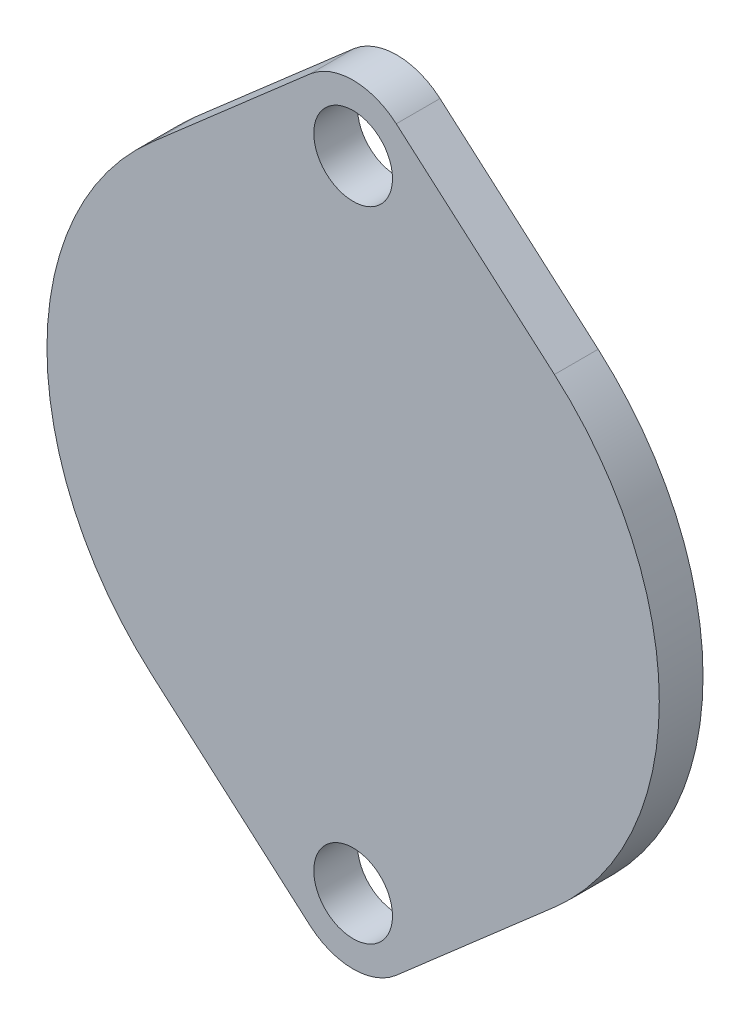
ISO-10303-21;
HEADER;
FILE_DESCRIPTION(('STEP AP214'),'2;1');
FILE_NAME('part.step','',(''),(''),'','','');
FILE_SCHEMA(('AUTOMOTIVE_DESIGN { 1 0 10303 214 1 1 1 1 }'));
ENDSEC;
DATA;
#1=APPLICATION_CONTEXT('core data for automotive mechanical design processes');
#2=APPLICATION_PROTOCOL_DEFINITION('international standard','automotive_design',2000,#1);
#3=PRODUCT_CONTEXT('',#1,'mechanical');
#4=PRODUCT('Part','Part','',(#3));
#5=PRODUCT_RELATED_PRODUCT_CATEGORY('part','',(#4));
#6=PRODUCT_DEFINITION_FORMATION('','',#4);
#7=PRODUCT_DEFINITION_CONTEXT('part definition',#1,'design');
#8=PRODUCT_DEFINITION('design','',#6,#7);
#9=PRODUCT_DEFINITION_SHAPE('','',#8);
#10=(LENGTH_UNIT() NAMED_UNIT(*) SI_UNIT(.MILLI.,.METRE.));
#11=(NAMED_UNIT(*) PLANE_ANGLE_UNIT() SI_UNIT($,.RADIAN.));
#12=(NAMED_UNIT(*) SI_UNIT($,.STERADIAN.) SOLID_ANGLE_UNIT());
#13=UNCERTAINTY_MEASURE_WITH_UNIT(LENGTH_MEASURE(1.E-05),#10,'distance_accuracy_value','');
#14=(GEOMETRIC_REPRESENTATION_CONTEXT(3) GLOBAL_UNCERTAINTY_ASSIGNED_CONTEXT((#13)) GLOBAL_UNIT_ASSIGNED_CONTEXT((#10,
#11,#12)) REPRESENTATION_CONTEXT('',''));
#15=CARTESIAN_POINT('',(0.,0.,0.));
#16=DIRECTION('',(0.,0.,1.));
#17=DIRECTION('',(1.,0.,0.));
#18=AXIS2_PLACEMENT_3D('',#15,#16,#17);
#19=CARTESIAN_POINT('',(0.,-36.5,5.));
#20=DIRECTION('',(0.,0.,1.));
#21=DIRECTION('',(1.,0.,0.));
#22=AXIS2_PLACEMENT_3D('',#19,#20,#21);
#23=PLANE('',#22);
#24=CARTESIAN_POINT('',(0.,36.5,5.));
#25=DIRECTION('',(0.,0.,1.));
#26=DIRECTION('',(1.,0.,0.));
#27=AXIS2_PLACEMENT_3D('',#24,#25,#26);
#28=CIRCLE('',#27,4.5);
#29=CARTESIAN_POINT('',(4.5,36.5,5.));
#30=VERTEX_POINT('',#29);
#31=EDGE_CURVE('E132',#30,#30,#28,.T.);
#32=ORIENTED_EDGE('',*,*,#31,.F.);
#33=EDGE_LOOP('',(#32));
#34=FACE_BOUND('',#33,.T.);
#35=CARTESIAN_POINT('',(0.,-36.5,5.));
#36=DIRECTION('',(0.,0.,1.));
#37=DIRECTION('',(1.,0.,0.));
#38=AXIS2_PLACEMENT_3D('',#35,#36,#37);
#39=CIRCLE('',#38,7.5);
#40=CARTESIAN_POINT('',(-4.93150684931507,-42.1506849315069,5.));
#41=VERTEX_POINT('',#40);
#42=CARTESIAN_POINT('',(4.93150684931507,-42.1506849315069,5.));
#43=VERTEX_POINT('',#42);
#44=EDGE_CURVE('E143',#41,#43,#39,.T.);
#45=ORIENTED_EDGE('',*,*,#44,.T.);
#46=DIRECTION('',(0.753424657534247,0.657534246575342,0.));
#47=VECTOR('',#46,1.);
#48=CARTESIAN_POINT('',(4.93150684931507,-42.1506849315069,5.));
#49=LINE('',#48,#47);
#50=CARTESIAN_POINT('',(23.013698630137,-26.3698630136986,5.));
#51=VERTEX_POINT('',#50);
#52=EDGE_CURVE('E91',#43,#51,#49,.T.);
#53=ORIENTED_EDGE('',*,*,#52,.T.);
#54=CARTESIAN_POINT('',(0.,0.,5.));
#55=DIRECTION('',(0.,0.,1.));
#56=DIRECTION('',(1.,0.,0.));
#57=AXIS2_PLACEMENT_3D('',#54,#55,#56);
#58=CIRCLE('',#57,35.);
#59=CARTESIAN_POINT('',(23.013698630137,26.3698630136986,5.));
#60=VERTEX_POINT('',#59);
#61=EDGE_CURVE('E158',#51,#60,#58,.T.);
#62=ORIENTED_EDGE('',*,*,#61,.T.);
#63=DIRECTION('',(-0.753424657534247,0.657534246575342,0.));
#64=VECTOR('',#63,1.);
#65=CARTESIAN_POINT('',(23.013698630137,26.3698630136986,5.));
#66=LINE('',#65,#64);
#67=CARTESIAN_POINT('',(4.93150684931507,42.1506849315069,5.));
#68=VERTEX_POINT('',#67);
#69=EDGE_CURVE('E171',#60,#68,#66,.T.);
#70=ORIENTED_EDGE('',*,*,#69,.T.);
#71=CARTESIAN_POINT('',(0.,36.5,5.));
#72=DIRECTION('',(0.,0.,1.));
#73=DIRECTION('',(1.,0.,0.));
#74=AXIS2_PLACEMENT_3D('',#71,#72,#73);
#75=CIRCLE('',#74,7.5);
#76=CARTESIAN_POINT('',(-4.93150684931507,42.1506849315069,5.));
#77=VERTEX_POINT('',#76);
#78=EDGE_CURVE('E110',#68,#77,#75,.T.);
#79=ORIENTED_EDGE('',*,*,#78,.T.);
#80=DIRECTION('',(-0.753424657534247,-0.657534246575342,0.));
#81=VECTOR('',#80,1.);
#82=CARTESIAN_POINT('',(-23.013698630137,26.3698630136986,5.));
#83=LINE('',#82,#81);
#84=CARTESIAN_POINT('',(-23.013698630137,26.3698630136986,5.));
#85=VERTEX_POINT('',#84);
#86=EDGE_CURVE('E104',#77,#85,#83,.T.);
#87=ORIENTED_EDGE('',*,*,#86,.T.);
#88=CARTESIAN_POINT('',(0.,0.,5.));
#89=DIRECTION('',(0.,0.,1.));
#90=DIRECTION('',(1.,0.,0.));
#91=AXIS2_PLACEMENT_3D('',#88,#89,#90);
#92=CIRCLE('',#91,35.);
#93=CARTESIAN_POINT('',(-23.013698630137,-26.3698630136987,5.));
#94=VERTEX_POINT('',#93);
#95=EDGE_CURVE('E108',#85,#94,#92,.T.);
#96=ORIENTED_EDGE('',*,*,#95,.T.);
#97=DIRECTION('',(0.753424657534247,-0.657534246575342,0.));
#98=VECTOR('',#97,1.);
#99=CARTESIAN_POINT('',(-4.93150684931507,-42.1506849315069,5.));
#100=LINE('',#99,#98);
#101=EDGE_CURVE('E48',#94,#41,#100,.T.);
#102=ORIENTED_EDGE('',*,*,#101,.T.);
#103=EDGE_LOOP('',(#45,#53,#62,#70,#79,#87,#96,#102));
#104=FACE_BOUND('',#103,.T.);
#105=CARTESIAN_POINT('',(0.,-36.5,5.));
#106=DIRECTION('',(0.,0.,1.));
#107=DIRECTION('',(1.,0.,0.));
#108=AXIS2_PLACEMENT_3D('',#105,#106,#107);
#109=CIRCLE('',#108,4.5);
#110=CARTESIAN_POINT('',(4.5,-36.5,5.));
#111=VERTEX_POINT('',#110);
#112=EDGE_CURVE('E180',#111,#111,#109,.T.);
#113=ORIENTED_EDGE('',*,*,#112,.F.);
#114=EDGE_LOOP('',(#113));
#115=FACE_BOUND('',#114,.T.);
#116=ADVANCED_FACE('F31',(#34,#104,#115),#23,.T.);
#117=CARTESIAN_POINT('',(0.,-36.5,0.));
#118=DIRECTION('',(0.,0.,1.));
#119=DIRECTION('',(1.,0.,0.));
#120=AXIS2_PLACEMENT_3D('',#117,#118,#119);
#121=PLANE('',#120);
#122=CARTESIAN_POINT('',(0.,36.5,0.));
#123=DIRECTION('',(0.,0.,1.));
#124=DIRECTION('',(1.,0.,0.));
#125=AXIS2_PLACEMENT_3D('',#122,#123,#124);
#126=CIRCLE('',#125,4.5);
#127=CARTESIAN_POINT('',(4.5,36.5,0.));
#128=VERTEX_POINT('',#127);
#129=EDGE_CURVE('E177',#128,#128,#126,.T.);
#130=ORIENTED_EDGE('',*,*,#129,.T.);
#131=EDGE_LOOP('',(#130));
#132=FACE_BOUND('',#131,.T.);
#133=CARTESIAN_POINT('',(0.,-36.5,0.));
#134=DIRECTION('',(0.,0.,1.));
#135=DIRECTION('',(1.,0.,0.));
#136=AXIS2_PLACEMENT_3D('',#133,#134,#135);
#137=CIRCLE('',#136,7.5);
#138=CARTESIAN_POINT('',(-4.93150684931507,-42.1506849315069,0.));
#139=VERTEX_POINT('',#138);
#140=CARTESIAN_POINT('',(4.93150684931507,-42.1506849315069,0.));
#141=VERTEX_POINT('',#140);
#142=EDGE_CURVE('E128',#139,#141,#137,.T.);
#143=ORIENTED_EDGE('',*,*,#142,.F.);
#144=DIRECTION('',(0.753424657534247,-0.657534246575342,0.));
#145=VECTOR('',#144,1.);
#146=CARTESIAN_POINT('',(-4.93150684931507,-42.1506849315069,0.));
#147=LINE('',#146,#145);
#148=CARTESIAN_POINT('',(-23.013698630137,-26.3698630136987,0.));
#149=VERTEX_POINT('',#148);
#150=EDGE_CURVE('E83',#149,#139,#147,.T.);
#151=ORIENTED_EDGE('',*,*,#150,.F.);
#152=CARTESIAN_POINT('',(0.,0.,0.));
#153=DIRECTION('',(0.,0.,1.));
#154=DIRECTION('',(1.,0.,0.));
#155=AXIS2_PLACEMENT_3D('',#152,#153,#154);
#156=CIRCLE('',#155,35.);
#157=CARTESIAN_POINT('',(-23.013698630137,26.3698630136986,0.));
#158=VERTEX_POINT('',#157);
#159=EDGE_CURVE('E77',#158,#149,#156,.T.);
#160=ORIENTED_EDGE('',*,*,#159,.F.);
#161=DIRECTION('',(-0.753424657534247,-0.657534246575342,0.));
#162=VECTOR('',#161,1.);
#163=CARTESIAN_POINT('',(-23.013698630137,26.3698630136986,0.));
#164=LINE('',#163,#162);
#165=CARTESIAN_POINT('',(-4.93150684931507,42.1506849315069,0.));
#166=VERTEX_POINT('',#165);
#167=EDGE_CURVE('E118',#166,#158,#164,.T.);
#168=ORIENTED_EDGE('',*,*,#167,.F.);
#169=CARTESIAN_POINT('',(0.,36.5,0.));
#170=DIRECTION('',(0.,0.,1.));
#171=DIRECTION('',(1.,0.,0.));
#172=AXIS2_PLACEMENT_3D('',#169,#170,#171);
#173=CIRCLE('',#172,7.5);
#174=CARTESIAN_POINT('',(4.93150684931507,42.1506849315069,0.));
#175=VERTEX_POINT('',#174);
#176=EDGE_CURVE('E138',#175,#166,#173,.T.);
#177=ORIENTED_EDGE('',*,*,#176,.F.);
#178=DIRECTION('',(-0.753424657534247,0.657534246575342,0.));
#179=VECTOR('',#178,1.);
#180=CARTESIAN_POINT('',(23.013698630137,26.3698630136986,0.));
#181=LINE('',#180,#179);
#182=CARTESIAN_POINT('',(23.013698630137,26.3698630136986,0.));
#183=VERTEX_POINT('',#182);
#184=EDGE_CURVE('E136',#183,#175,#181,.T.);
#185=ORIENTED_EDGE('',*,*,#184,.F.);
#186=CARTESIAN_POINT('',(0.,0.,0.));
#187=DIRECTION('',(0.,0.,1.));
#188=DIRECTION('',(1.,0.,0.));
#189=AXIS2_PLACEMENT_3D('',#186,#187,#188);
#190=CIRCLE('',#189,35.);
#191=CARTESIAN_POINT('',(23.013698630137,-26.3698630136986,0.));
#192=VERTEX_POINT('',#191);
#193=EDGE_CURVE('E134',#192,#183,#190,.T.);
#194=ORIENTED_EDGE('',*,*,#193,.F.);
#195=DIRECTION('',(0.753424657534247,0.657534246575342,0.));
#196=VECTOR('',#195,1.);
#197=CARTESIAN_POINT('',(4.93150684931507,-42.1506849315069,0.));
#198=LINE('',#197,#196);
#199=EDGE_CURVE('E131',#141,#192,#198,.T.);
#200=ORIENTED_EDGE('',*,*,#199,.F.);
#201=EDGE_LOOP('',(#143,#151,#160,#168,#177,#185,#194,#200));
#202=FACE_BOUND('',#201,.T.);
#203=CARTESIAN_POINT('',(0.,-36.5,0.));
#204=DIRECTION('',(0.,0.,1.));
#205=DIRECTION('',(1.,0.,0.));
#206=AXIS2_PLACEMENT_3D('',#203,#204,#205);
#207=CIRCLE('',#206,4.5);
#208=CARTESIAN_POINT('',(4.5,-36.5,0.));
#209=VERTEX_POINT('',#208);
#210=EDGE_CURVE('E183',#209,#209,#207,.T.);
#211=ORIENTED_EDGE('',*,*,#210,.T.);
#212=EDGE_LOOP('',(#211));
#213=FACE_BOUND('',#212,.T.);
#214=ADVANCED_FACE('F162',(#132,#202,#213),#121,.F.);
#215=CARTESIAN_POINT('',(0.,-36.5,5.));
#216=DIRECTION('',(0.,0.,-1.));
#217=DIRECTION('',(-1.,0.,0.));
#218=AXIS2_PLACEMENT_3D('',#215,#216,#217);
#219=CYLINDRICAL_SURFACE('',#218,7.5);
#220=ORIENTED_EDGE('',*,*,#142,.T.);
#221=DIRECTION('',(0.,0.,-1.));
#222=VECTOR('',#221,1.);
#223=CARTESIAN_POINT('',(4.93150684931507,-42.1506849315069,5.));
#224=LINE('',#223,#222);
#225=EDGE_CURVE('E11',#43,#141,#224,.T.);
#226=ORIENTED_EDGE('',*,*,#225,.F.);
#227=ORIENTED_EDGE('',*,*,#44,.F.);
#228=DIRECTION('',(0.,0.,-1.));
#229=VECTOR('',#228,1.);
#230=CARTESIAN_POINT('',(-4.93150684931507,-42.1506849315069,5.));
#231=LINE('',#230,#229);
#232=EDGE_CURVE('E124',#41,#139,#231,.T.);
#233=ORIENTED_EDGE('',*,*,#232,.T.);
#234=EDGE_LOOP('',(#220,#226,#227,#233));
#235=FACE_BOUND('',#234,.T.);
#236=ADVANCED_FACE('F33',(#235),#219,.T.);
#237=CARTESIAN_POINT('',(4.93150684931507,-42.1506849315069,5.));
#238=DIRECTION('',(-0.657534246575342,0.753424657534247,0.));
#239=DIRECTION('',(-0.753424657534247,-0.657534246575342,0.));
#240=AXIS2_PLACEMENT_3D('',#237,#238,#239);
#241=PLANE('',#240);
#242=ORIENTED_EDGE('',*,*,#199,.T.);
#243=DIRECTION('',(0.,0.,-1.));
#244=VECTOR('',#243,1.);
#245=CARTESIAN_POINT('',(23.013698630137,-26.3698630136986,5.));
#246=LINE('',#245,#244);
#247=EDGE_CURVE('E40',#51,#192,#246,.T.);
#248=ORIENTED_EDGE('',*,*,#247,.F.);
#249=ORIENTED_EDGE('',*,*,#52,.F.);
#250=ORIENTED_EDGE('',*,*,#225,.T.);
#251=EDGE_LOOP('',(#242,#248,#249,#250));
#252=FACE_BOUND('',#251,.T.);
#253=ADVANCED_FACE('F216',(#252),#241,.F.);
#254=CARTESIAN_POINT('',(0.,0.,5.));
#255=DIRECTION('',(0.,0.,-1.));
#256=DIRECTION('',(-1.,0.,0.));
#257=AXIS2_PLACEMENT_3D('',#254,#255,#256);
#258=CYLINDRICAL_SURFACE('',#257,35.);
#259=ORIENTED_EDGE('',*,*,#193,.T.);
#260=DIRECTION('',(0.,0.,-1.));
#261=VECTOR('',#260,1.);
#262=CARTESIAN_POINT('',(23.013698630137,26.3698630136986,5.));
#263=LINE('',#262,#261);
#264=EDGE_CURVE('E150',#60,#183,#263,.T.);
#265=ORIENTED_EDGE('',*,*,#264,.F.);
#266=ORIENTED_EDGE('',*,*,#61,.F.);
#267=ORIENTED_EDGE('',*,*,#247,.T.);
#268=EDGE_LOOP('',(#259,#265,#266,#267));
#269=FACE_BOUND('',#268,.T.);
#270=ADVANCED_FACE('F156',(#269),#258,.T.);
#271=CARTESIAN_POINT('',(23.013698630137,26.3698630136986,5.));
#272=DIRECTION('',(-0.657534246575342,-0.753424657534247,0.));
#273=DIRECTION('',(0.753424657534247,-0.657534246575342,0.));
#274=AXIS2_PLACEMENT_3D('',#271,#272,#273);
#275=PLANE('',#274);
#276=ORIENTED_EDGE('',*,*,#184,.T.);
#277=DIRECTION('',(0.,0.,-1.));
#278=VECTOR('',#277,1.);
#279=CARTESIAN_POINT('',(4.93150684931507,42.1506849315069,5.));
#280=LINE('',#279,#278);
#281=EDGE_CURVE('E147',#68,#175,#280,.T.);
#282=ORIENTED_EDGE('',*,*,#281,.F.);
#283=ORIENTED_EDGE('',*,*,#69,.F.);
#284=ORIENTED_EDGE('',*,*,#264,.T.);
#285=EDGE_LOOP('',(#276,#282,#283,#284));
#286=FACE_BOUND('',#285,.T.);
#287=ADVANCED_FACE('F167',(#286),#275,.F.);
#288=CARTESIAN_POINT('',(0.,36.5,5.));
#289=DIRECTION('',(0.,0.,-1.));
#290=DIRECTION('',(-1.,0.,0.));
#291=AXIS2_PLACEMENT_3D('',#288,#289,#290);
#292=CYLINDRICAL_SURFACE('',#291,7.5);
#293=ORIENTED_EDGE('',*,*,#176,.T.);
#294=DIRECTION('',(0.,0.,-1.));
#295=VECTOR('',#294,1.);
#296=CARTESIAN_POINT('',(-4.93150684931507,42.1506849315069,5.));
#297=LINE('',#296,#295);
#298=EDGE_CURVE('E119',#77,#166,#297,.T.);
#299=ORIENTED_EDGE('',*,*,#298,.F.);
#300=ORIENTED_EDGE('',*,*,#78,.F.);
#301=ORIENTED_EDGE('',*,*,#281,.T.);
#302=EDGE_LOOP('',(#293,#299,#300,#301));
#303=FACE_BOUND('',#302,.T.);
#304=ADVANCED_FACE('F170',(#303),#292,.T.);
#305=CARTESIAN_POINT('',(-23.013698630137,26.3698630136986,5.));
#306=DIRECTION('',(0.657534246575342,-0.753424657534247,0.));
#307=DIRECTION('',(0.753424657534247,0.657534246575342,0.));
#308=AXIS2_PLACEMENT_3D('',#305,#306,#307);
#309=PLANE('',#308);
#310=ORIENTED_EDGE('',*,*,#167,.T.);
#311=DIRECTION('',(0.,0.,-1.));
#312=VECTOR('',#311,1.);
#313=CARTESIAN_POINT('',(-23.013698630137,26.3698630136986,5.));
#314=LINE('',#313,#312);
#315=EDGE_CURVE('E115',#85,#158,#314,.T.);
#316=ORIENTED_EDGE('',*,*,#315,.F.);
#317=ORIENTED_EDGE('',*,*,#86,.F.);
#318=ORIENTED_EDGE('',*,*,#298,.T.);
#319=EDGE_LOOP('',(#310,#316,#317,#318));
#320=FACE_BOUND('',#319,.T.);
#321=ADVANCED_FACE('F116',(#320),#309,.F.);
#322=CARTESIAN_POINT('',(0.,0.,5.));
#323=DIRECTION('',(0.,0.,-1.));
#324=DIRECTION('',(-1.,0.,0.));
#325=AXIS2_PLACEMENT_3D('',#322,#323,#324);
#326=CYLINDRICAL_SURFACE('',#325,35.);
#327=ORIENTED_EDGE('',*,*,#159,.T.);
#328=DIRECTION('',(0.,0.,-1.));
#329=VECTOR('',#328,1.);
#330=CARTESIAN_POINT('',(-23.013698630137,-26.3698630136987,5.));
#331=LINE('',#330,#329);
#332=EDGE_CURVE('E120',#94,#149,#331,.T.);
#333=ORIENTED_EDGE('',*,*,#332,.F.);
#334=ORIENTED_EDGE('',*,*,#95,.F.);
#335=ORIENTED_EDGE('',*,*,#315,.T.);
#336=EDGE_LOOP('',(#327,#333,#334,#335));
#337=FACE_BOUND('',#336,.T.);
#338=ADVANCED_FACE('F122',(#337),#326,.T.);
#339=CARTESIAN_POINT('',(-4.93150684931507,-42.1506849315069,5.));
#340=DIRECTION('',(0.657534246575342,0.753424657534247,0.));
#341=DIRECTION('',(-0.753424657534247,0.657534246575342,0.));
#342=AXIS2_PLACEMENT_3D('',#339,#340,#341);
#343=PLANE('',#342);
#344=ORIENTED_EDGE('',*,*,#150,.T.);
#345=ORIENTED_EDGE('',*,*,#232,.F.);
#346=ORIENTED_EDGE('',*,*,#101,.F.);
#347=ORIENTED_EDGE('',*,*,#332,.T.);
#348=EDGE_LOOP('',(#344,#345,#346,#347));
#349=FACE_BOUND('',#348,.T.);
#350=ADVANCED_FACE('F204',(#349),#343,.F.);
#351=CARTESIAN_POINT('',(0.,36.5,5.));
#352=DIRECTION('',(0.,0.,-1.));
#353=DIRECTION('',(-1.,0.,0.));
#354=AXIS2_PLACEMENT_3D('',#351,#352,#353);
#355=CYLINDRICAL_SURFACE('',#354,4.5);
#356=ORIENTED_EDGE('',*,*,#31,.T.);
#357=EDGE_LOOP('',(#356));
#358=FACE_BOUND('',#357,.T.);
#359=ORIENTED_EDGE('',*,*,#129,.F.);
#360=EDGE_LOOP('',(#359));
#361=FACE_BOUND('',#360,.T.);
#362=ADVANCED_FACE('F201',(#358,#361),#355,.F.);
#363=CARTESIAN_POINT('',(0.,-36.5,5.));
#364=DIRECTION('',(0.,0.,-1.));
#365=DIRECTION('',(-1.,0.,0.));
#366=AXIS2_PLACEMENT_3D('',#363,#364,#365);
#367=CYLINDRICAL_SURFACE('',#366,4.5);
#368=ORIENTED_EDGE('',*,*,#112,.T.);
#369=EDGE_LOOP('',(#368));
#370=FACE_BOUND('',#369,.T.);
#371=ORIENTED_EDGE('',*,*,#210,.F.);
#372=EDGE_LOOP('',(#371));
#373=FACE_BOUND('',#372,.T.);
#374=ADVANCED_FACE('F189',(#370,#373),#367,.F.);
#375=CLOSED_SHELL('',(#116,#214,#236,#253,#270,#287,#304,#321,#338,#350,#362,#374));
#376=MANIFOLD_SOLID_BREP('B2',#375);
#377=ADVANCED_BREP_SHAPE_REPRESENTATION('',(#18,#376),#14);
#378=SHAPE_DEFINITION_REPRESENTATION(#9,#377);
ENDSEC;
END-ISO-10303-21;
